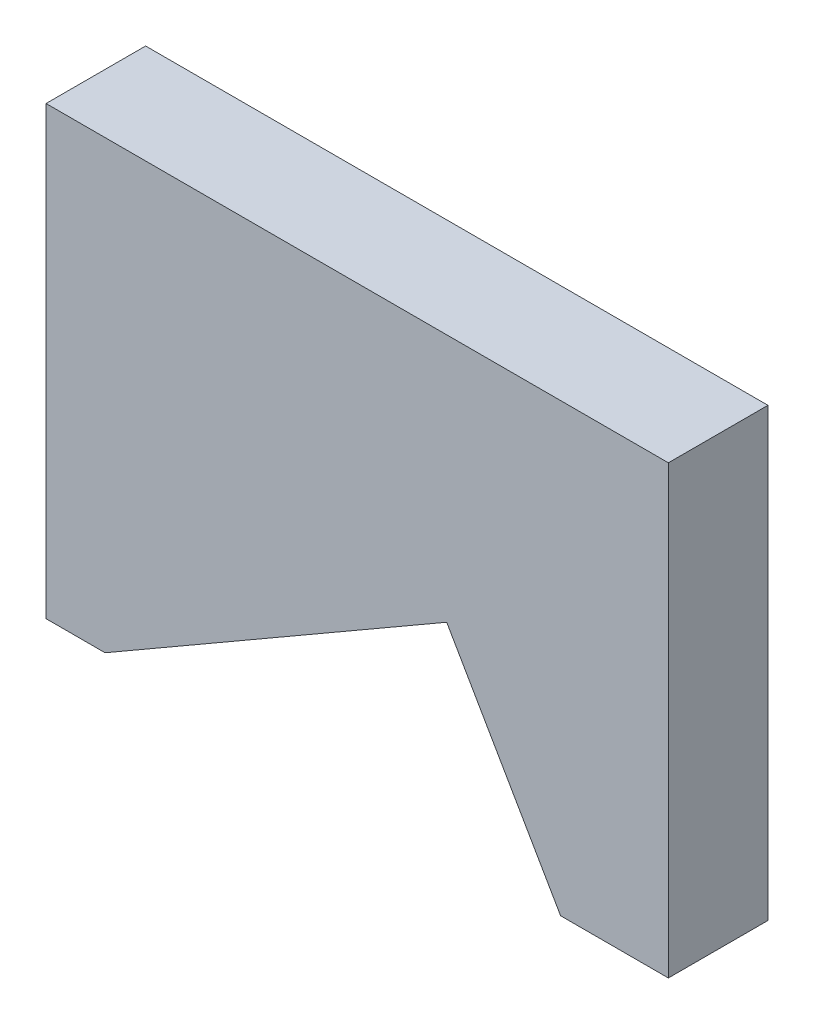
ISO-10303-21;
HEADER;
FILE_DESCRIPTION(('STEP AP214'),'2;1');
FILE_NAME('part.step','',(''),(''),'','','');
FILE_SCHEMA(('AUTOMOTIVE_DESIGN { 1 0 10303 214 1 1 1 1 }'));
ENDSEC;
DATA;
#1=APPLICATION_CONTEXT('core data for automotive mechanical design processes');
#2=APPLICATION_PROTOCOL_DEFINITION('international standard','automotive_design',2000,#1);
#3=PRODUCT_CONTEXT('',#1,'mechanical');
#4=PRODUCT('Part','Part','',(#3));
#5=PRODUCT_RELATED_PRODUCT_CATEGORY('part','',(#4));
#6=PRODUCT_DEFINITION_FORMATION('','',#4);
#7=PRODUCT_DEFINITION_CONTEXT('part definition',#1,'design');
#8=PRODUCT_DEFINITION('design','',#6,#7);
#9=PRODUCT_DEFINITION_SHAPE('','',#8);
#10=(LENGTH_UNIT() NAMED_UNIT(*) SI_UNIT(.MILLI.,.METRE.));
#11=(NAMED_UNIT(*) PLANE_ANGLE_UNIT() SI_UNIT($,.RADIAN.));
#12=(NAMED_UNIT(*) SI_UNIT($,.STERADIAN.) SOLID_ANGLE_UNIT());
#13=UNCERTAINTY_MEASURE_WITH_UNIT(LENGTH_MEASURE(1.E-05),#10,'distance_accuracy_value','');
#14=(GEOMETRIC_REPRESENTATION_CONTEXT(3) GLOBAL_UNCERTAINTY_ASSIGNED_CONTEXT((#13)) GLOBAL_UNIT_ASSIGNED_CONTEXT((#10,
#11,#12)) REPRESENTATION_CONTEXT('',''));
#15=CARTESIAN_POINT('',(0.,0.,0.));
#16=DIRECTION('',(0.,0.,1.));
#17=DIRECTION('',(1.,0.,0.));
#18=AXIS2_PLACEMENT_3D('',#15,#16,#17);
#19=CARTESIAN_POINT('',(0.,25.4,0.));
#20=DIRECTION('',(1.,0.,0.));
#21=DIRECTION('',(0.,0.,-1.));
#22=AXIS2_PLACEMENT_3D('',#19,#20,#21);
#23=PLANE('',#22);
#24=DIRECTION('',(0.,-1.,0.));
#25=VECTOR('',#24,1.);
#26=CARTESIAN_POINT('',(0.,25.4,0.));
#27=LINE('',#26,#25);
#28=CARTESIAN_POINT('',(0.,25.4,0.));
#29=VERTEX_POINT('',#28);
#30=CARTESIAN_POINT('',(0.,-20.1269471542316,0.));
#31=VERTEX_POINT('',#30);
#32=EDGE_CURVE('E103',#29,#31,#27,.T.);
#33=ORIENTED_EDGE('',*,*,#32,.T.);
#34=DIRECTION('',(0.,0.,-1.));
#35=VECTOR('',#34,1.);
#36=CARTESIAN_POINT('',(0.,-20.1269471542316,10.16));
#37=LINE('',#36,#35);
#38=CARTESIAN_POINT('',(0.,-20.1269471542316,10.16));
#39=VERTEX_POINT('',#38);
#40=EDGE_CURVE('E91',#39,#31,#37,.T.);
#41=ORIENTED_EDGE('',*,*,#40,.F.);
#42=DIRECTION('',(0.,-1.,0.));
#43=VECTOR('',#42,1.);
#44=CARTESIAN_POINT('',(0.,25.4,10.16));
#45=LINE('',#44,#43);
#46=CARTESIAN_POINT('',(0.,25.4,10.16));
#47=VERTEX_POINT('',#46);
#48=EDGE_CURVE('E40',#47,#39,#45,.T.);
#49=ORIENTED_EDGE('',*,*,#48,.F.);
#50=DIRECTION('',(0.,0.,1.));
#51=VECTOR('',#50,1.);
#52=CARTESIAN_POINT('',(0.,25.4,0.));
#53=LINE('',#52,#51);
#54=EDGE_CURVE('E123',#29,#47,#53,.T.);
#55=ORIENTED_EDGE('',*,*,#54,.F.);
#56=EDGE_LOOP('',(#33,#41,#49,#55));
#57=FACE_BOUND('',#56,.T.);
#58=ADVANCED_FACE('F33',(#57),#23,.F.);
#59=CARTESIAN_POINT('',(0.,25.4,10.16));
#60=DIRECTION('',(0.,0.,-1.));
#61=DIRECTION('',(-1.,0.,0.));
#62=AXIS2_PLACEMENT_3D('',#59,#60,#61);
#63=PLANE('',#62);
#64=ORIENTED_EDGE('',*,*,#48,.T.);
#65=DIRECTION('',(1.,0.,0.));
#66=VECTOR('',#65,1.);
#67=CARTESIAN_POINT('',(63.5,-20.1269471542316,10.16));
#68=LINE('',#67,#66);
#69=CARTESIAN_POINT('',(6.02028394209383,-20.1269471542316,10.16));
#70=VERTEX_POINT('',#69);
#71=EDGE_CURVE('E88',#39,#70,#68,.T.);
#72=ORIENTED_EDGE('',*,*,#71,.T.);
#73=DIRECTION('',(-0.866025403784438,-0.500000000000001,0.));
#74=VECTOR('',#73,1.);
#75=CARTESIAN_POINT('',(-14.5413261912508,-31.9981982996902,10.16));
#76=LINE('',#75,#74);
#77=CARTESIAN_POINT('',(40.8811790144766,0.,10.16));
#78=VERTEX_POINT('',#77);
#79=EDGE_CURVE('E125',#78,#70,#76,.T.);
#80=ORIENTED_EDGE('',*,*,#79,.F.);
#81=DIRECTION('',(-0.500000000000001,0.866025403784438,0.));
#82=VECTOR('',#81,1.);
#83=CARTESIAN_POINT('',(65.4686464444492,-42.5867428181575,10.16));
#84=LINE('',#83,#82);
#85=CARTESIAN_POINT('',(52.5014773719376,-20.1269471542316,10.16));
#86=VERTEX_POINT('',#85);
#87=EDGE_CURVE('E130',#86,#78,#84,.T.);
#88=ORIENTED_EDGE('',*,*,#87,.F.);
#89=CARTESIAN_POINT('',(63.5,-20.1269471542316,10.16));
#90=VERTEX_POINT('',#89);
#91=EDGE_CURVE('E54',#86,#90,#68,.T.);
#92=ORIENTED_EDGE('',*,*,#91,.T.);
#93=DIRECTION('',(0.,-1.,0.));
#94=VECTOR('',#93,1.);
#95=CARTESIAN_POINT('',(63.5,25.4,10.16));
#96=LINE('',#95,#94);
#97=CARTESIAN_POINT('',(63.5,25.4,10.16));
#98=VERTEX_POINT('',#97);
#99=EDGE_CURVE('E110',#98,#90,#96,.T.);
#100=ORIENTED_EDGE('',*,*,#99,.F.);
#101=DIRECTION('',(1.,0.,0.));
#102=VECTOR('',#101,1.);
#103=CARTESIAN_POINT('',(0.,25.4,10.16));
#104=LINE('',#103,#102);
#105=EDGE_CURVE('E108',#47,#98,#104,.T.);
#106=ORIENTED_EDGE('',*,*,#105,.F.);
#107=EDGE_LOOP('',(#64,#72,#80,#88,#92,#100,#106));
#108=FACE_BOUND('',#107,.T.);
#109=ADVANCED_FACE('F106',(#108),#63,.F.);
#110=CARTESIAN_POINT('',(63.5,25.4,0.));
#111=DIRECTION('',(-1.,0.,0.));
#112=DIRECTION('',(0.,0.,1.));
#113=AXIS2_PLACEMENT_3D('',#110,#111,#112);
#114=PLANE('',#113);
#115=ORIENTED_EDGE('',*,*,#99,.T.);
#116=DIRECTION('',(0.,0.,-1.));
#117=VECTOR('',#116,1.);
#118=CARTESIAN_POINT('',(63.5,-20.1269471542316,10.16));
#119=LINE('',#118,#117);
#120=CARTESIAN_POINT('',(63.5,-20.1269471542316,0.));
#121=VERTEX_POINT('',#120);
#122=EDGE_CURVE('E104',#90,#121,#119,.T.);
#123=ORIENTED_EDGE('',*,*,#122,.T.);
#124=DIRECTION('',(0.,-1.,0.));
#125=VECTOR('',#124,1.);
#126=CARTESIAN_POINT('',(63.5,25.4,0.));
#127=LINE('',#126,#125);
#128=CARTESIAN_POINT('',(63.5,25.4,0.));
#129=VERTEX_POINT('',#128);
#130=EDGE_CURVE('E112',#129,#121,#127,.T.);
#131=ORIENTED_EDGE('',*,*,#130,.F.);
#132=DIRECTION('',(0.,0.,-1.));
#133=VECTOR('',#132,1.);
#134=CARTESIAN_POINT('',(63.5,25.4,0.));
#135=LINE('',#134,#133);
#136=EDGE_CURVE('E120',#98,#129,#135,.T.);
#137=ORIENTED_EDGE('',*,*,#136,.F.);
#138=EDGE_LOOP('',(#115,#123,#131,#137));
#139=FACE_BOUND('',#138,.T.);
#140=ADVANCED_FACE('F147',(#139),#114,.F.);
#141=CARTESIAN_POINT('',(0.,25.4,0.));
#142=DIRECTION('',(0.,0.,1.));
#143=DIRECTION('',(1.,0.,0.));
#144=AXIS2_PLACEMENT_3D('',#141,#142,#143);
#145=PLANE('',#144);
#146=ORIENTED_EDGE('',*,*,#130,.T.);
#147=DIRECTION('',(1.,0.,0.));
#148=VECTOR('',#147,1.);
#149=CARTESIAN_POINT('',(63.5,-20.1269471542316,0.));
#150=LINE('',#149,#148);
#151=CARTESIAN_POINT('',(52.5014773719376,-20.1269471542316,0.));
#152=VERTEX_POINT('',#151);
#153=EDGE_CURVE('E140',#152,#121,#150,.T.);
#154=ORIENTED_EDGE('',*,*,#153,.F.);
#155=DIRECTION('',(0.500000000000001,-0.866025403784438,0.));
#156=VECTOR('',#155,1.);
#157=CARTESIAN_POINT('',(65.4686464444492,-42.5867428181575,0.));
#158=LINE('',#157,#156);
#159=CARTESIAN_POINT('',(40.8811790144766,0.,0.));
#160=VERTEX_POINT('',#159);
#161=EDGE_CURVE('E133',#160,#152,#158,.T.);
#162=ORIENTED_EDGE('',*,*,#161,.F.);
#163=DIRECTION('',(0.866025403784438,0.500000000000001,0.));
#164=VECTOR('',#163,1.);
#165=CARTESIAN_POINT('',(-14.5413261912508,-31.9981982996902,0.));
#166=LINE('',#165,#164);
#167=CARTESIAN_POINT('',(6.0202839420938,-20.1269471542316,0.));
#168=VERTEX_POINT('',#167);
#169=EDGE_CURVE('E128',#168,#160,#166,.T.);
#170=ORIENTED_EDGE('',*,*,#169,.F.);
#171=EDGE_CURVE('E47',#31,#168,#150,.T.);
#172=ORIENTED_EDGE('',*,*,#171,.F.);
#173=ORIENTED_EDGE('',*,*,#32,.F.);
#174=DIRECTION('',(-1.,0.,0.));
#175=VECTOR('',#174,1.);
#176=CARTESIAN_POINT('',(0.,25.4,0.));
#177=LINE('',#176,#175);
#178=EDGE_CURVE('E118',#129,#29,#177,.T.);
#179=ORIENTED_EDGE('',*,*,#178,.F.);
#180=EDGE_LOOP('',(#146,#154,#162,#170,#172,#173,#179));
#181=FACE_BOUND('',#180,.T.);
#182=ADVANCED_FACE('F150',(#181),#145,.F.);
#183=CARTESIAN_POINT('',(0.,25.4,0.));
#184=DIRECTION('',(0.,1.,0.));
#185=DIRECTION('',(0.,0.,1.));
#186=AXIS2_PLACEMENT_3D('',#183,#184,#185);
#187=PLANE('',#186);
#188=ORIENTED_EDGE('',*,*,#54,.T.);
#189=ORIENTED_EDGE('',*,*,#105,.T.);
#190=ORIENTED_EDGE('',*,*,#136,.T.);
#191=ORIENTED_EDGE('',*,*,#178,.T.);
#192=EDGE_LOOP('',(#188,#189,#190,#191));
#193=FACE_BOUND('',#192,.T.);
#194=ADVANCED_FACE('F152',(#193),#187,.T.);
#195=CARTESIAN_POINT('',(13.9058950723831,-15.5741874454343,11.43));
#196=DIRECTION('',(0.500000000000001,-0.866025403784438,0.));
#197=DIRECTION('',(0.866025403784438,0.500000000000001,0.));
#198=AXIS2_PLACEMENT_3D('',#195,#196,#197);
#199=PLANE('',#198);
#200=DIRECTION('',(0.,0.,1.));
#201=VECTOR('',#200,1.);
#202=CARTESIAN_POINT('',(6.0202839420938,-20.1269471542316,11.43));
#203=LINE('',#202,#201);
#204=EDGE_CURVE('E92',#168,#70,#203,.T.);
#205=ORIENTED_EDGE('',*,*,#204,.F.);
#206=ORIENTED_EDGE('',*,*,#169,.T.);
#207=DIRECTION('',(0.,0.,1.));
#208=VECTOR('',#207,1.);
#209=CARTESIAN_POINT('',(40.8811790144766,0.,0.));
#210=LINE('',#209,#208);
#211=EDGE_CURVE('E127',#160,#78,#210,.T.);
#212=ORIENTED_EDGE('',*,*,#211,.T.);
#213=ORIENTED_EDGE('',*,*,#79,.T.);
#214=EDGE_LOOP('',(#205,#206,#212,#213));
#215=FACE_BOUND('',#214,.T.);
#216=ADVANCED_FACE('F159',(#215),#199,.T.);
#217=CARTESIAN_POINT('',(40.8811790144766,0.,11.43));
#218=DIRECTION('',(-0.866025403784438,-0.500000000000001,0.));
#219=DIRECTION('',(0.500000000000001,-0.866025403784438,0.));
#220=AXIS2_PLACEMENT_3D('',#217,#218,#219);
#221=PLANE('',#220);
#222=DIRECTION('',(0.,0.,-1.));
#223=VECTOR('',#222,1.);
#224=CARTESIAN_POINT('',(52.5014773719376,-20.1269471542316,11.43));
#225=LINE('',#224,#223);
#226=EDGE_CURVE('E11',#86,#152,#225,.T.);
#227=ORIENTED_EDGE('',*,*,#226,.F.);
#228=ORIENTED_EDGE('',*,*,#87,.T.);
#229=ORIENTED_EDGE('',*,*,#211,.F.);
#230=ORIENTED_EDGE('',*,*,#161,.T.);
#231=EDGE_LOOP('',(#227,#228,#229,#230));
#232=FACE_BOUND('',#231,.T.);
#233=ADVANCED_FACE('F156',(#232),#221,.T.);
#234=CARTESIAN_POINT('',(63.5,-20.1269471542316,10.16));
#235=DIRECTION('',(0.,1.,0.));
#236=DIRECTION('',(0.,0.,1.));
#237=AXIS2_PLACEMENT_3D('',#234,#235,#236);
#238=PLANE('',#237);
#239=ORIENTED_EDGE('',*,*,#226,.T.);
#240=ORIENTED_EDGE('',*,*,#153,.T.);
#241=ORIENTED_EDGE('',*,*,#122,.F.);
#242=ORIENTED_EDGE('',*,*,#91,.F.);
#243=EDGE_LOOP('',(#239,#240,#241,#242));
#244=FACE_BOUND('',#243,.T.);
#245=ADVANCED_FACE('F142',(#244),#238,.F.);
#246=ORIENTED_EDGE('',*,*,#204,.T.);
#247=ORIENTED_EDGE('',*,*,#71,.F.);
#248=ORIENTED_EDGE('',*,*,#40,.T.);
#249=ORIENTED_EDGE('',*,*,#171,.T.);
#250=EDGE_LOOP('',(#246,#247,#248,#249));
#251=FACE_BOUND('',#250,.T.);
#252=ADVANCED_FACE('F90',(#251),#238,.F.);
#253=CLOSED_SHELL('',(#58,#109,#140,#182,#194,#216,#233,#245,#252));
#254=MANIFOLD_SOLID_BREP('B2',#253);
#255=ADVANCED_BREP_SHAPE_REPRESENTATION('',(#18,#254),#14);
#256=SHAPE_DEFINITION_REPRESENTATION(#9,#255);
ENDSEC;
END-ISO-10303-21;
